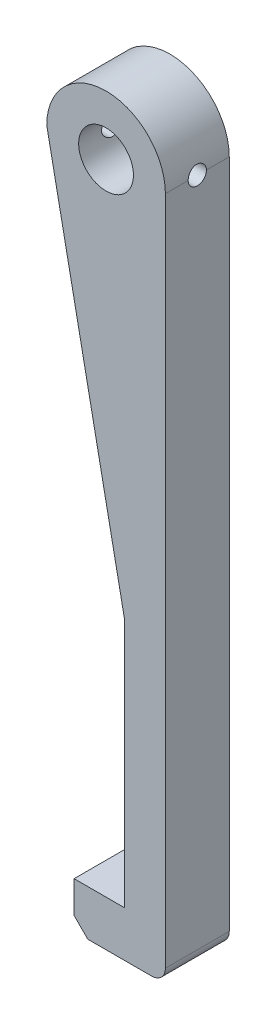
ISO-10303-21;
HEADER;
FILE_DESCRIPTION(('STEP AP214'),'2;1');
FILE_NAME('part.step','',(''),(''),'','','');
FILE_SCHEMA(('AUTOMOTIVE_DESIGN { 1 0 10303 214 1 1 1 1 }'));
ENDSEC;
DATA;
#1=APPLICATION_CONTEXT('core data for automotive mechanical design processes');
#2=APPLICATION_PROTOCOL_DEFINITION('international standard','automotive_design',2000,#1);
#3=PRODUCT_CONTEXT('',#1,'mechanical');
#4=PRODUCT('Part','Part','',(#3));
#5=PRODUCT_RELATED_PRODUCT_CATEGORY('part','',(#4));
#6=PRODUCT_DEFINITION_FORMATION('','',#4);
#7=PRODUCT_DEFINITION_CONTEXT('part definition',#1,'design');
#8=PRODUCT_DEFINITION('design','',#6,#7);
#9=PRODUCT_DEFINITION_SHAPE('','',#8);
#10=(LENGTH_UNIT() NAMED_UNIT(*) SI_UNIT(.MILLI.,.METRE.));
#11=(NAMED_UNIT(*) PLANE_ANGLE_UNIT() SI_UNIT($,.RADIAN.));
#12=(NAMED_UNIT(*) SI_UNIT($,.STERADIAN.) SOLID_ANGLE_UNIT());
#13=UNCERTAINTY_MEASURE_WITH_UNIT(LENGTH_MEASURE(1.E-05),#10,'distance_accuracy_value','');
#14=(GEOMETRIC_REPRESENTATION_CONTEXT(3) GLOBAL_UNCERTAINTY_ASSIGNED_CONTEXT((#13)) GLOBAL_UNIT_ASSIGNED_CONTEXT((#10,
#11,#12)) REPRESENTATION_CONTEXT('',''));
#15=CARTESIAN_POINT('',(0.,0.,0.));
#16=DIRECTION('',(0.,0.,1.));
#17=DIRECTION('',(1.,0.,0.));
#18=AXIS2_PLACEMENT_3D('',#15,#16,#17);
#19=CARTESIAN_POINT('',(-3.99999999999999,75.,14.));
#20=DIRECTION('',(0.,0.,-1.));
#21=DIRECTION('',(-1.,0.,0.));
#22=AXIS2_PLACEMENT_3D('',#19,#20,#21);
#23=PLANE('',#22);
#24=DIRECTION('',(1.,0.,0.));
#25=VECTOR('',#24,1.);
#26=CARTESIAN_POINT('',(-7.99999999999999,-75.,14.));
#27=LINE('',#26,#25);
#28=CARTESIAN_POINT('',(-7.99999999999999,-75.,14.));
#29=VERTEX_POINT('',#28);
#30=CARTESIAN_POINT('',(6.00000000000001,-75.,14.));
#31=VERTEX_POINT('',#30);
#32=EDGE_CURVE('E236',#29,#31,#27,.T.);
#33=ORIENTED_EDGE('',*,*,#32,.T.);
#34=CARTESIAN_POINT('',(6.00000000000001,-72.,14.));
#35=DIRECTION('',(0.,0.,-1.));
#36=DIRECTION('',(-1.,0.,0.));
#37=AXIS2_PLACEMENT_3D('',#34,#35,#36);
#38=CIRCLE('',#37,3.);
#39=CARTESIAN_POINT('',(9.00000000000001,-72.,14.));
#40=VERTEX_POINT('',#39);
#41=EDGE_CURVE('E11',#31,#40,#38,.F.);
#42=ORIENTED_EDGE('',*,*,#41,.T.);
#43=DIRECTION('',(0.,1.,0.));
#44=VECTOR('',#43,1.);
#45=CARTESIAN_POINT('',(9.00000000000001,-75.,14.));
#46=LINE('',#45,#44);
#47=CARTESIAN_POINT('',(9.00000000000001,75.,14.));
#48=VERTEX_POINT('',#47);
#49=EDGE_CURVE('E260',#40,#48,#46,.T.);
#50=ORIENTED_EDGE('',*,*,#49,.T.);
#51=CARTESIAN_POINT('',(-3.99999999999999,75.,14.));
#52=DIRECTION('',(0.,0.,1.));
#53=DIRECTION('',(-1.,0.,0.));
#54=AXIS2_PLACEMENT_3D('',#51,#52,#53);
#55=CIRCLE('',#54,13.);
#56=CARTESIAN_POINT('',(-17.,75.,14.));
#57=VERTEX_POINT('',#56);
#58=EDGE_CURVE('E262',#48,#57,#55,.T.);
#59=ORIENTED_EDGE('',*,*,#58,.T.);
#60=DIRECTION('',(0.196116135138184,-0.98058067569092,0.));
#61=VECTOR('',#60,1.);
#62=CARTESIAN_POINT('',(0.,-10.,14.));
#63=LINE('',#62,#61);
#64=CARTESIAN_POINT('',(0.,-10.,14.));
#65=VERTEX_POINT('',#64);
#66=EDGE_CURVE('E141',#57,#65,#63,.T.);
#67=ORIENTED_EDGE('',*,*,#66,.T.);
#68=DIRECTION('',(0.,-1.,0.));
#69=VECTOR('',#68,1.);
#70=CARTESIAN_POINT('',(0.,-65.,14.));
#71=LINE('',#70,#69);
#72=CARTESIAN_POINT('',(0.,-65.,14.));
#73=VERTEX_POINT('',#72);
#74=EDGE_CURVE('E249',#65,#73,#71,.T.);
#75=ORIENTED_EDGE('',*,*,#74,.T.);
#76=DIRECTION('',(-1.,0.,0.));
#77=VECTOR('',#76,1.);
#78=CARTESIAN_POINT('',(0.,-65.,14.));
#79=LINE('',#78,#77);
#80=CARTESIAN_POINT('',(-11.,-65.,14.));
#81=VERTEX_POINT('',#80);
#82=EDGE_CURVE('E252',#73,#81,#79,.T.);
#83=ORIENTED_EDGE('',*,*,#82,.T.);
#84=DIRECTION('',(0.,-1.,0.));
#85=VECTOR('',#84,1.);
#86=CARTESIAN_POINT('',(-11.,-65.,14.));
#87=LINE('',#86,#85);
#88=CARTESIAN_POINT('',(-11.,-72.,14.));
#89=VERTEX_POINT('',#88);
#90=EDGE_CURVE('E255',#81,#89,#87,.T.);
#91=ORIENTED_EDGE('',*,*,#90,.T.);
#92=DIRECTION('',(0.707106781186547,-0.707106781186548,0.));
#93=VECTOR('',#92,1.);
#94=CARTESIAN_POINT('',(-11.,-72.,14.));
#95=LINE('',#94,#93);
#96=EDGE_CURVE('E257',#89,#29,#95,.T.);
#97=ORIENTED_EDGE('',*,*,#96,.T.);
#98=EDGE_LOOP('',(#33,#42,#50,#59,#67,#75,#83,#91,#97));
#99=FACE_BOUND('',#98,.T.);
#100=CARTESIAN_POINT('',(-3.99999999999999,75.,14.));
#101=DIRECTION('',(0.,0.,1.));
#102=DIRECTION('',(1.,0.,0.));
#103=AXIS2_PLACEMENT_3D('',#100,#101,#102);
#104=CIRCLE('',#103,6.00000000000001);
#105=CARTESIAN_POINT('',(2.00000000000002,75.,14.));
#106=VERTEX_POINT('',#105);
#107=EDGE_CURVE('E240',#106,#106,#104,.T.);
#108=ORIENTED_EDGE('',*,*,#107,.F.);
#109=EDGE_LOOP('',(#108));
#110=FACE_BOUND('',#109,.T.);
#111=ADVANCED_FACE('F37',(#99,#110),#23,.F.);
#112=CARTESIAN_POINT('',(-3.99999999999999,75.,0.));
#113=DIRECTION('',(0.,0.,-1.));
#114=DIRECTION('',(-1.,0.,0.));
#115=AXIS2_PLACEMENT_3D('',#112,#113,#114);
#116=PLANE('',#115);
#117=DIRECTION('',(0.,1.,0.));
#118=VECTOR('',#117,1.);
#119=CARTESIAN_POINT('',(9.00000000000001,-75.,0.));
#120=LINE('',#119,#118);
#121=CARTESIAN_POINT('',(9.00000000000001,-72.,0.));
#122=VERTEX_POINT('',#121);
#123=CARTESIAN_POINT('',(9.00000000000001,75.,0.));
#124=VERTEX_POINT('',#123);
#125=EDGE_CURVE('E272',#122,#124,#120,.T.);
#126=ORIENTED_EDGE('',*,*,#125,.F.);
#127=CARTESIAN_POINT('',(6.00000000000001,-72.,0.));
#128=DIRECTION('',(0.,0.,-1.));
#129=DIRECTION('',(-1.,0.,0.));
#130=AXIS2_PLACEMENT_3D('',#127,#128,#129);
#131=CIRCLE('',#130,3.);
#132=CARTESIAN_POINT('',(6.00000000000001,-75.,0.));
#133=VERTEX_POINT('',#132);
#134=EDGE_CURVE('E59',#122,#133,#131,.T.);
#135=ORIENTED_EDGE('',*,*,#134,.T.);
#136=DIRECTION('',(1.,0.,0.));
#137=VECTOR('',#136,1.);
#138=CARTESIAN_POINT('',(-7.99999999999999,-75.,0.));
#139=LINE('',#138,#137);
#140=CARTESIAN_POINT('',(-7.99999999999999,-75.,0.));
#141=VERTEX_POINT('',#140);
#142=EDGE_CURVE('E270',#141,#133,#139,.T.);
#143=ORIENTED_EDGE('',*,*,#142,.F.);
#144=DIRECTION('',(0.707106781186547,-0.707106781186548,0.));
#145=VECTOR('',#144,1.);
#146=CARTESIAN_POINT('',(-11.,-72.,0.));
#147=LINE('',#146,#145);
#148=CARTESIAN_POINT('',(-11.,-72.,0.));
#149=VERTEX_POINT('',#148);
#150=EDGE_CURVE('E268',#149,#141,#147,.T.);
#151=ORIENTED_EDGE('',*,*,#150,.F.);
#152=DIRECTION('',(0.,-1.,0.));
#153=VECTOR('',#152,1.);
#154=CARTESIAN_POINT('',(-11.,-65.,0.));
#155=LINE('',#154,#153);
#156=CARTESIAN_POINT('',(-11.,-65.,0.));
#157=VERTEX_POINT('',#156);
#158=EDGE_CURVE('E266',#157,#149,#155,.T.);
#159=ORIENTED_EDGE('',*,*,#158,.F.);
#160=DIRECTION('',(-1.,0.,0.));
#161=VECTOR('',#160,1.);
#162=CARTESIAN_POINT('',(0.,-65.,0.));
#163=LINE('',#162,#161);
#164=CARTESIAN_POINT('',(0.,-65.,0.));
#165=VERTEX_POINT('',#164);
#166=EDGE_CURVE('E244',#165,#157,#163,.T.);
#167=ORIENTED_EDGE('',*,*,#166,.F.);
#168=DIRECTION('',(0.,-1.,0.));
#169=VECTOR('',#168,1.);
#170=CARTESIAN_POINT('',(0.,-65.,0.));
#171=LINE('',#170,#169);
#172=CARTESIAN_POINT('',(0.,-10.,0.));
#173=VERTEX_POINT('',#172);
#174=EDGE_CURVE('E242',#173,#165,#171,.T.);
#175=ORIENTED_EDGE('',*,*,#174,.F.);
#176=DIRECTION('',(0.196116135138184,-0.98058067569092,0.));
#177=VECTOR('',#176,1.);
#178=CARTESIAN_POINT('',(0.,-10.,0.));
#179=LINE('',#178,#177);
#180=CARTESIAN_POINT('',(-17.,75.,0.));
#181=VERTEX_POINT('',#180);
#182=EDGE_CURVE('E253',#181,#173,#179,.T.);
#183=ORIENTED_EDGE('',*,*,#182,.F.);
#184=CARTESIAN_POINT('',(-3.99999999999999,75.,0.));
#185=DIRECTION('',(0.,0.,1.));
#186=DIRECTION('',(-1.,0.,0.));
#187=AXIS2_PLACEMENT_3D('',#184,#185,#186);
#188=CIRCLE('',#187,13.);
#189=EDGE_CURVE('E274',#124,#181,#188,.T.);
#190=ORIENTED_EDGE('',*,*,#189,.F.);
#191=EDGE_LOOP('',(#126,#135,#143,#151,#159,#167,#175,#183,#190));
#192=FACE_BOUND('',#191,.T.);
#193=CARTESIAN_POINT('',(-3.99999999999999,75.,0.));
#194=DIRECTION('',(0.,0.,1.));
#195=DIRECTION('',(1.,0.,0.));
#196=AXIS2_PLACEMENT_3D('',#193,#194,#195);
#197=CIRCLE('',#196,6.00000000000001);
#198=CARTESIAN_POINT('',(2.00000000000002,75.,0.));
#199=VERTEX_POINT('',#198);
#200=EDGE_CURVE('E243',#199,#199,#197,.T.);
#201=ORIENTED_EDGE('',*,*,#200,.T.);
#202=EDGE_LOOP('',(#201));
#203=FACE_BOUND('',#202,.T.);
#204=ADVANCED_FACE('F225',(#192,#203),#116,.T.);
#205=CARTESIAN_POINT('',(0.,-65.,14.));
#206=DIRECTION('',(1.,0.,0.));
#207=DIRECTION('',(0.,1.,0.));
#208=AXIS2_PLACEMENT_3D('',#205,#206,#207);
#209=PLANE('',#208);
#210=ORIENTED_EDGE('',*,*,#174,.T.);
#211=DIRECTION('',(0.,0.,-1.));
#212=VECTOR('',#211,1.);
#213=CARTESIAN_POINT('',(0.,-65.,14.));
#214=LINE('',#213,#212);
#215=EDGE_CURVE('E160',#73,#165,#214,.T.);
#216=ORIENTED_EDGE('',*,*,#215,.F.);
#217=ORIENTED_EDGE('',*,*,#74,.F.);
#218=DIRECTION('',(0.,0.,-1.));
#219=VECTOR('',#218,1.);
#220=CARTESIAN_POINT('',(0.,-10.,14.));
#221=LINE('',#220,#219);
#222=EDGE_CURVE('E147',#65,#173,#221,.T.);
#223=ORIENTED_EDGE('',*,*,#222,.T.);
#224=EDGE_LOOP('',(#210,#216,#217,#223));
#225=FACE_BOUND('',#224,.T.);
#226=ADVANCED_FACE('F222',(#225),#209,.F.);
#227=CARTESIAN_POINT('',(0.,-65.,14.));
#228=DIRECTION('',(0.,-1.,0.));
#229=DIRECTION('',(0.,0.,-1.));
#230=AXIS2_PLACEMENT_3D('',#227,#228,#229);
#231=PLANE('',#230);
#232=ORIENTED_EDGE('',*,*,#166,.T.);
#233=DIRECTION('',(0.,0.,-1.));
#234=VECTOR('',#233,1.);
#235=CARTESIAN_POINT('',(-11.,-65.,14.));
#236=LINE('',#235,#234);
#237=EDGE_CURVE('E157',#81,#157,#236,.T.);
#238=ORIENTED_EDGE('',*,*,#237,.F.);
#239=ORIENTED_EDGE('',*,*,#82,.F.);
#240=ORIENTED_EDGE('',*,*,#215,.T.);
#241=EDGE_LOOP('',(#232,#238,#239,#240));
#242=FACE_BOUND('',#241,.T.);
#243=ADVANCED_FACE('F219',(#242),#231,.F.);
#244=CARTESIAN_POINT('',(-11.,-65.,14.));
#245=DIRECTION('',(1.,0.,0.));
#246=DIRECTION('',(0.,0.,-1.));
#247=AXIS2_PLACEMENT_3D('',#244,#245,#246);
#248=PLANE('',#247);
#249=ORIENTED_EDGE('',*,*,#158,.T.);
#250=DIRECTION('',(0.,0.,-1.));
#251=VECTOR('',#250,1.);
#252=CARTESIAN_POINT('',(-11.,-72.,14.));
#253=LINE('',#252,#251);
#254=EDGE_CURVE('E154',#89,#149,#253,.T.);
#255=ORIENTED_EDGE('',*,*,#254,.F.);
#256=ORIENTED_EDGE('',*,*,#90,.F.);
#257=ORIENTED_EDGE('',*,*,#237,.T.);
#258=EDGE_LOOP('',(#249,#255,#256,#257));
#259=FACE_BOUND('',#258,.T.);
#260=ADVANCED_FACE('F215',(#259),#248,.F.);
#261=CARTESIAN_POINT('',(-11.,-72.,14.));
#262=DIRECTION('',(0.707106781186548,0.707106781186547,0.));
#263=DIRECTION('',(-0.707106781186547,0.707106781186548,0.));
#264=AXIS2_PLACEMENT_3D('',#261,#262,#263);
#265=PLANE('',#264);
#266=ORIENTED_EDGE('',*,*,#150,.T.);
#267=DIRECTION('',(0.,0.,-1.));
#268=VECTOR('',#267,1.);
#269=CARTESIAN_POINT('',(-7.99999999999999,-75.,14.));
#270=LINE('',#269,#268);
#271=EDGE_CURVE('E151',#29,#141,#270,.T.);
#272=ORIENTED_EDGE('',*,*,#271,.F.);
#273=ORIENTED_EDGE('',*,*,#96,.F.);
#274=ORIENTED_EDGE('',*,*,#254,.T.);
#275=EDGE_LOOP('',(#266,#272,#273,#274));
#276=FACE_BOUND('',#275,.T.);
#277=ADVANCED_FACE('F212',(#276),#265,.F.);
#278=CARTESIAN_POINT('',(-7.99999999999999,-75.,14.));
#279=DIRECTION('',(0.,1.,0.));
#280=DIRECTION('',(0.,0.,1.));
#281=AXIS2_PLACEMENT_3D('',#278,#279,#280);
#282=PLANE('',#281);
#283=ORIENTED_EDGE('',*,*,#142,.T.);
#284=DIRECTION('',(0.,0.,-1.));
#285=VECTOR('',#284,1.);
#286=CARTESIAN_POINT('',(6.00000000000001,-75.,14.));
#287=LINE('',#286,#285);
#288=EDGE_CURVE('E45',#133,#31,#287,.F.);
#289=ORIENTED_EDGE('',*,*,#288,.T.);
#290=ORIENTED_EDGE('',*,*,#32,.F.);
#291=ORIENTED_EDGE('',*,*,#271,.T.);
#292=EDGE_LOOP('',(#283,#289,#290,#291));
#293=FACE_BOUND('',#292,.T.);
#294=ADVANCED_FACE('F208',(#293),#282,.F.);
#295=CARTESIAN_POINT('',(9.00000000000001,-75.,14.));
#296=DIRECTION('',(-1.,0.,0.));
#297=DIRECTION('',(0.,0.,1.));
#298=AXIS2_PLACEMENT_3D('',#295,#296,#297);
#299=PLANE('',#298);
#300=ORIENTED_EDGE('',*,*,#49,.F.);
#301=DIRECTION('',(0.,0.,-1.));
#302=VECTOR('',#301,1.);
#303=CARTESIAN_POINT('',(9.00000000000001,-72.,14.));
#304=LINE('',#303,#302);
#305=EDGE_CURVE('E163',#40,#122,#304,.T.);
#306=ORIENTED_EDGE('',*,*,#305,.T.);
#307=ORIENTED_EDGE('',*,*,#125,.T.);
#308=DIRECTION('',(0.,0.,-1.));
#309=VECTOR('',#308,1.);
#310=CARTESIAN_POINT('',(9.00000000000001,75.,14.));
#311=LINE('',#310,#309);
#312=CARTESIAN_POINT('',(9.00000000000001,75.,5.));
#313=VERTEX_POINT('',#312);
#314=EDGE_CURVE('E142',#313,#124,#311,.T.);
#315=ORIENTED_EDGE('',*,*,#314,.F.);
#316=CARTESIAN_POINT('',(9.00000000000001,75.,7.));
#317=DIRECTION('',(1.,0.,0.));
#318=DIRECTION('',(0.,0.,-1.));
#319=AXIS2_PLACEMENT_3D('',#316,#317,#318);
#320=CIRCLE('',#319,2.);
#321=CARTESIAN_POINT('',(9.00000000000001,75.,9.));
#322=VERTEX_POINT('',#321);
#323=EDGE_CURVE('E172',#322,#313,#320,.T.);
#324=ORIENTED_EDGE('',*,*,#323,.F.);
#325=EDGE_CURVE('E145',#48,#322,#311,.T.);
#326=ORIENTED_EDGE('',*,*,#325,.F.);
#327=EDGE_LOOP('',(#300,#306,#307,#315,#324,#326));
#328=FACE_BOUND('',#327,.T.);
#329=ADVANCED_FACE('F203',(#328),#299,.F.);
#330=CARTESIAN_POINT('',(-3.99999999999999,75.,14.));
#331=DIRECTION('',(0.,0.,-1.));
#332=DIRECTION('',(-1.,0.,0.));
#333=AXIS2_PLACEMENT_3D('',#330,#331,#332);
#334=CYLINDRICAL_SURFACE('',#333,13.);
#335=ORIENTED_EDGE('',*,*,#325,.T.);
#336=CARTESIAN_POINT('',(9.00000000000001,75.,9.));
#337=CARTESIAN_POINT('',(9.00000200624245,75.0559173083005,9.00000001239874));
#338=CARTESIAN_POINT('',(8.99963876887101,75.1118075129407,8.99765345986566));
#339=CARTESIAN_POINT('',(8.99820310813059,75.223181650767,8.98829464061037));
#340=CARTESIAN_POINT('',(8.99713074888542,75.2786656202291,8.98128279575661));
#341=CARTESIAN_POINT('',(8.99288768795326,75.4437675589348,8.9533283726329));
#342=CARTESIAN_POINT('',(8.98869082967937,75.5522695590988,8.92546664135297));
#343=CARTESIAN_POINT('',(8.9780206664357,75.762984825654,8.85211273096216));
#344=CARTESIAN_POINT('',(8.9715467598383,75.8651964216393,8.80661589208778));
#345=CARTESIAN_POINT('',(8.95703796949745,76.0605486271046,8.69930852348968));
#346=CARTESIAN_POINT('',(8.9490031213996,76.1536894436517,8.63749836628475));
#347=CARTESIAN_POINT('',(8.93219283293925,76.3289898773499,8.49878989750917));
#348=CARTESIAN_POINT('',(8.92341245834179,76.4110652364726,8.42178573508671));
#349=CARTESIAN_POINT('',(8.90613809032032,76.5611929048478,8.25509333231553));
#350=CARTESIAN_POINT('',(8.89764414198702,76.6292430147134,8.16540310629901));
#351=CARTESIAN_POINT('',(8.88185694054029,76.7497101043496,7.97531549862524));
#352=CARTESIAN_POINT('',(8.87457013171583,76.8020443194494,7.87486508497874));
#353=CARTESIAN_POINT('',(8.86209105054054,76.8890627247252,7.66647484799151));
#354=CARTESIAN_POINT('',(8.85689853675243,76.9237489495407,7.55853588963749));
#355=CARTESIAN_POINT('',(8.84924460376366,76.9742254954324,7.33912552477942));
#356=CARTESIAN_POINT('',(8.84676205917367,76.9901620553452,7.22768851183686));
#357=CARTESIAN_POINT('',(8.8447450549237,77.0031401167573,7.00369377438666));
#358=CARTESIAN_POINT('',(8.84521048790529,77.0001823063452,6.89113609084026));
#359=CARTESIAN_POINT('',(8.84901764435481,76.9755743251789,6.66913655889084));
#360=CARTESIAN_POINT('',(8.85233417589048,76.9540878659661,6.55967606909733));
#361=CARTESIAN_POINT('',(8.8614304435468,76.8932890474257,6.3459332847649));
#362=CARTESIAN_POINT('',(8.86721023773971,76.8539762678351,6.24165111237127));
#363=CARTESIAN_POINT('',(8.88060961035569,76.7584706885592,6.04072634293581));
#364=CARTESIAN_POINT('',(8.88823672130586,76.7022085418932,5.94411723172592));
#365=CARTESIAN_POINT('',(8.90446555589918,76.5744527548831,5.76165288740311));
#366=CARTESIAN_POINT('',(8.91306730885393,76.5029586563929,5.67579797787801));
#367=CARTESIAN_POINT('',(8.93038651121885,76.3458823434593,5.51633694291781));
#368=CARTESIAN_POINT('',(8.93910423303172,76.2601612508695,5.44286759621104));
#369=CARTESIAN_POINT('',(8.95559266881333,76.0775026154478,5.31131545778279));
#370=CARTESIAN_POINT('',(8.96336311083526,75.9805618671538,5.25323707893776));
#371=CARTESIAN_POINT('',(8.97709124951905,75.7780818125592,5.15410757337316));
#372=CARTESIAN_POINT('',(8.98304672478885,75.6725321681694,5.11307729019673));
#373=CARTESIAN_POINT('',(8.99244962385738,75.4560021049891,5.04942215694251));
#374=CARTESIAN_POINT('',(8.99590079425467,75.345030065049,5.02676980629542));
#375=CARTESIAN_POINT('',(8.99860544316276,75.1943578417745,5.00908241398876));
#376=CARTESIAN_POINT('',(8.99912799956423,75.1555317571228,5.00567500883258));
#377=CARTESIAN_POINT('',(8.99982490122987,75.0778093814998,5.00113679973477));
#378=CARTESIAN_POINT('',(8.99999983296923,75.0389133197724,5.00000216139794));
#379=CARTESIAN_POINT('',(9.00000000000001,75.,5.));
#380=B_SPLINE_CURVE_WITH_KNOTS('',3,(#336,#337,#338,#339,#340,#341,#342,#343,#344,#345,#346,
#347,#348,#349,#350,#351,#352,#353,#354,#355,#356,#357,#358,#359,#360,#361,#362,#363,#364,#365,
#366,#367,#368,#369,#370,#371,#372,#373,#374,#375,#376,#377,#378,#379),.UNSPECIFIED.,.F.,.F.,(4,
2,2,2,2,2,2,2,2,2,2,2,2,2,2,2,2,2,2,2,2,4),(0.,0.167647874144424,0.335280590451942,
0.669853037401047,1.00451394949927,1.33916722019099,1.67623990416831,2.01336540646609,
2.35223637510513,2.69106826640134,3.02723952521046,3.36339854152085,3.69661747686578,
4.02984426839434,4.36445338669547,4.69907257077792,5.03717430503675,5.37537287471738,
5.71398372855854,6.05208694879281,6.16897288073366,6.28566144723498),.UNSPECIFIED.);
#381=EDGE_CURVE('E137',#322,#313,#380,.T.);
#382=ORIENTED_EDGE('',*,*,#381,.T.);
#383=ORIENTED_EDGE('',*,*,#314,.T.);
#384=ORIENTED_EDGE('',*,*,#189,.T.);
#385=DIRECTION('',(0.,0.,-1.));
#386=VECTOR('',#385,1.);
#387=CARTESIAN_POINT('',(-17.,75.,14.));
#388=LINE('',#387,#386);
#389=CARTESIAN_POINT('',(-17.,75.,5.));
#390=VERTEX_POINT('',#389);
#391=EDGE_CURVE('E136',#390,#181,#388,.T.);
#392=ORIENTED_EDGE('',*,*,#391,.F.);
#393=CARTESIAN_POINT('',(-17.,75.,5.));
#394=CARTESIAN_POINT('',(-17.0000020062424,75.0559173083005,4.99999998760126));
#395=CARTESIAN_POINT('',(-16.999638768871,75.1118075129407,5.00234654013434));
#396=CARTESIAN_POINT('',(-16.9982031081306,75.223181650767,5.01170535938963));
#397=CARTESIAN_POINT('',(-16.9971307488854,75.2786656202291,5.01871720424339));
#398=CARTESIAN_POINT('',(-16.9928876879532,75.4437675589348,5.0466716273671));
#399=CARTESIAN_POINT('',(-16.9886908296793,75.5522695590988,5.07453335864703));
#400=CARTESIAN_POINT('',(-16.9780206664357,75.762984825654,5.14788726903784));
#401=CARTESIAN_POINT('',(-16.9715467598383,75.8651964216393,5.19338410791222));
#402=CARTESIAN_POINT('',(-16.9570379694974,76.0605486271046,5.30069147651032));
#403=CARTESIAN_POINT('',(-16.9490031213996,76.1536894436517,5.36250163371525));
#404=CARTESIAN_POINT('',(-16.9321928329392,76.3289898773499,5.50121010249083));
#405=CARTESIAN_POINT('',(-16.9234124583418,76.4110652364726,5.57821426491328));
#406=CARTESIAN_POINT('',(-16.9061380903203,76.5611929048478,5.74490666768447));
#407=CARTESIAN_POINT('',(-16.897644141987,76.6292430147134,5.83459689370099));
#408=CARTESIAN_POINT('',(-16.8818569405403,76.7497101043496,6.02468450137476));
#409=CARTESIAN_POINT('',(-16.8745701317158,76.8020443194494,6.12513491502126));
#410=CARTESIAN_POINT('',(-16.8620910505405,76.8890627247252,6.33352515200849));
#411=CARTESIAN_POINT('',(-16.8568985367524,76.9237489495407,6.44146411036251));
#412=CARTESIAN_POINT('',(-16.8492446037636,76.9742254954324,6.66087447522058));
#413=CARTESIAN_POINT('',(-16.8467620591736,76.9901620553452,6.77231148816314));
#414=CARTESIAN_POINT('',(-16.8447450549237,77.0031401167573,6.99630622561334));
#415=CARTESIAN_POINT('',(-16.8452104879053,77.0001823063452,7.10886390915974));
#416=CARTESIAN_POINT('',(-16.8490176443548,76.9755743251789,7.33086344110916));
#417=CARTESIAN_POINT('',(-16.8523341758905,76.9540878659661,7.44032393090267));
#418=CARTESIAN_POINT('',(-16.8614304435468,76.8932890474257,7.6540667152351));
#419=CARTESIAN_POINT('',(-16.8672102377397,76.8539762678351,7.75834888762873));
#420=CARTESIAN_POINT('',(-16.8806096103557,76.7584706885592,7.95927365706419));
#421=CARTESIAN_POINT('',(-16.8882367213058,76.7022085418932,8.05588276827407));
#422=CARTESIAN_POINT('',(-16.9044655558992,76.5744527548831,8.23834711259689));
#423=CARTESIAN_POINT('',(-16.9130673088539,76.5029586563929,8.32420202212199));
#424=CARTESIAN_POINT('',(-16.9303865112188,76.3458823434593,8.48366305708219));
#425=CARTESIAN_POINT('',(-16.9391042330317,76.2601612508695,8.55713240378896));
#426=CARTESIAN_POINT('',(-16.9555926688133,76.0775026154478,8.68868454221721));
#427=CARTESIAN_POINT('',(-16.9633631108352,75.9805618671538,8.74676292106224));
#428=CARTESIAN_POINT('',(-16.977091249519,75.7780818125592,8.84589242662684));
#429=CARTESIAN_POINT('',(-16.9830467247888,75.6725321681695,8.88692270980327));
#430=CARTESIAN_POINT('',(-16.9924496238574,75.4560021049892,8.95057784305749));
#431=CARTESIAN_POINT('',(-16.9959007942546,75.345030065049,8.97323019370458));
#432=CARTESIAN_POINT('',(-16.9986054431627,75.1943578417745,8.99091758601124));
#433=CARTESIAN_POINT('',(-16.9991279995642,75.1555317571228,8.99432499116742));
#434=CARTESIAN_POINT('',(-16.9998249012299,75.0778093814998,8.99886320026523));
#435=CARTESIAN_POINT('',(-16.9999998329692,75.0389133197724,8.99999783860206));
#436=CARTESIAN_POINT('',(-17.,75.,9.));
#437=B_SPLINE_CURVE_WITH_KNOTS('',3,(#393,#394,#395,#396,#397,#398,#399,#400,#401,#402,#403,
#404,#405,#406,#407,#408,#409,#410,#411,#412,#413,#414,#415,#416,#417,#418,#419,#420,#421,#422,
#423,#424,#425,#426,#427,#428,#429,#430,#431,#432,#433,#434,#435,#436),.UNSPECIFIED.,.F.,.F.,(4,
2,2,2,2,2,2,2,2,2,2,2,2,2,2,2,2,2,2,2,2,4),(0.,0.167647874144424,0.335280590451941,
0.669853037401047,1.00451394949927,1.33916722019099,1.67623990416831,2.01336540646609,
2.35223637510513,2.69106826640134,3.02723952521046,3.36339854152085,3.69661747686578,
4.02984426839434,4.36445338669547,4.69907257077792,5.03717430503675,5.37537287471738,
5.71398372855853,6.05208694879281,6.16897288073366,6.28566144723498),.UNSPECIFIED.);
#438=CARTESIAN_POINT('',(-17.,75.,9.));
#439=VERTEX_POINT('',#438);
#440=EDGE_CURVE('E122',#390,#439,#437,.T.);
#441=ORIENTED_EDGE('',*,*,#440,.T.);
#442=EDGE_CURVE('E133',#57,#439,#388,.T.);
#443=ORIENTED_EDGE('',*,*,#442,.F.);
#444=ORIENTED_EDGE('',*,*,#58,.F.);
#445=EDGE_LOOP('',(#335,#382,#383,#384,#392,#441,#443,#444));
#446=FACE_BOUND('',#445,.T.);
#447=ADVANCED_FACE('F131',(#446),#334,.T.);
#448=CARTESIAN_POINT('',(0.,-10.,14.));
#449=DIRECTION('',(0.98058067569092,0.196116135138184,0.));
#450=DIRECTION('',(-0.196116135138184,0.98058067569092,0.));
#451=AXIS2_PLACEMENT_3D('',#448,#449,#450);
#452=PLANE('',#451);
#453=ORIENTED_EDGE('',*,*,#442,.T.);
#454=CARTESIAN_POINT('',(-17.,75.,7.));
#455=DIRECTION('',(0.98058067569092,0.196116135138184,0.));
#456=DIRECTION('',(0.196116135138184,-0.98058067569092,0.));
#457=AXIS2_PLACEMENT_3D('',#454,#455,#456);
#458=ELLIPSE('',#457,2.03960780543711,2.);
#459=EDGE_CURVE('E119',#439,#390,#458,.T.);
#460=ORIENTED_EDGE('',*,*,#459,.T.);
#461=ORIENTED_EDGE('',*,*,#391,.T.);
#462=ORIENTED_EDGE('',*,*,#182,.T.);
#463=ORIENTED_EDGE('',*,*,#222,.F.);
#464=ORIENTED_EDGE('',*,*,#66,.F.);
#465=EDGE_LOOP('',(#453,#460,#461,#462,#463,#464));
#466=FACE_BOUND('',#465,.T.);
#467=ADVANCED_FACE('F139',(#466),#452,.F.);
#468=CARTESIAN_POINT('',(-3.99999999999999,75.,14.));
#469=DIRECTION('',(0.,0.,-1.));
#470=DIRECTION('',(-1.,0.,0.));
#471=AXIS2_PLACEMENT_3D('',#468,#469,#470);
#472=CYLINDRICAL_SURFACE('',#471,6.00000000000001);
#473=CARTESIAN_POINT('',(-9.99999999999999,75.,9.));
#474=CARTESIAN_POINT('',(-10.0000003060189,74.8908732742266,9.00000050746328));
#475=CARTESIAN_POINT('',(-9.99699539015089,74.7817496109229,8.99103946774557));
#476=CARTESIAN_POINT('',(-9.98530420406561,74.5667164782541,8.95554178236556));
#477=CARTESIAN_POINT('',(-9.97661734404304,74.4608073437624,8.92900331210216));
#478=CARTESIAN_POINT('',(-9.95450615812885,74.2553344209964,8.8593615132319));
#479=CARTESIAN_POINT('',(-9.94108975461706,74.1557603482279,8.81628587508146));
#480=CARTESIAN_POINT('',(-9.91088891434683,73.9652501263894,8.71491765432331));
#481=CARTESIAN_POINT('',(-9.89410381335555,73.8743156860826,8.6566220699948));
#482=CARTESIAN_POINT('',(-9.85828188886009,73.7005166499555,8.52434839028249));
#483=CARTESIAN_POINT('',(-9.83919112927569,73.6179925994034,8.44993753147901));
#484=CARTESIAN_POINT('',(-9.80120629566242,73.4663346145958,8.28846569058686));
#485=CARTESIAN_POINT('',(-9.78231226581097,73.3972036290211,8.20140193014296));
#486=CARTESIAN_POINT('',(-9.74626664954547,73.2723501155443,8.01402976960707));
#487=CARTESIAN_POINT('',(-9.72918078551376,73.2170702835579,7.91341252053575));
#488=CARTESIAN_POINT('',(-9.69950610837202,73.1243622522446,7.7036478110829));
#489=CARTESIAN_POINT('',(-9.6869159232149,73.0869286052265,7.59450296567451));
#490=CARTESIAN_POINT('',(-9.66822606538754,73.0322530769817,7.37465355700657));
#491=CARTESIAN_POINT('',(-9.66192191539222,73.0143731034565,7.26412558302187));
#492=CARTESIAN_POINT('',(-9.65591313259015,72.9973177533311,7.04147249168823));
#493=CARTESIAN_POINT('',(-9.65620646045459,72.9981365967906,6.92934787858162));
#494=CARTESIAN_POINT('',(-9.6631803001636,73.0179601925932,6.71212673911195));
#495=CARTESIAN_POINT('',(-9.66956831735065,73.036132173666,6.60694319416196));
#496=CARTESIAN_POINT('',(-9.68753315449101,73.0887876743012,6.40121316078632));
#497=CARTESIAN_POINT('',(-9.69911059568215,73.1232731468163,6.30066722912986));
#498=CARTESIAN_POINT('',(-9.72635822262497,73.2081218838796,6.10517450081704));
#499=CARTESIAN_POINT('',(-9.74209131586234,73.2587319025855,6.01034394906094));
#500=CARTESIAN_POINT('',(-9.77585117151452,73.3742217873937,5.83025818344054));
#501=CARTESIAN_POINT('',(-9.79387859580927,73.439105775272,5.74500574613323));
#502=CARTESIAN_POINT('',(-9.83134658335481,73.5853013346355,5.58181680367845));
#503=CARTESIAN_POINT('',(-9.85081178709685,73.6672936998474,5.50449461098186));
#504=CARTESIAN_POINT('',(-9.88813876774073,73.8433208600599,5.3645374666732));
#505=CARTESIAN_POINT('',(-9.90600039076134,73.9373568086784,5.30190392367101));
#506=CARTESIAN_POINT('',(-9.93834215875587,74.1361047739075,5.19260739952986));
#507=CARTESIAN_POINT('',(-9.95278700016078,74.2409134471673,5.14610901731853));
#508=CARTESIAN_POINT('',(-9.97641134288869,74.457461833271,5.07159365208858));
#509=CARTESIAN_POINT('',(-9.98559267309758,74.5691991236901,5.04357024915312));
#510=CARTESIAN_POINT('',(-9.9973525414288,74.7912323409414,5.00788866795528));
#511=CARTESIAN_POINT('',(-10.0002000366746,74.9013808002703,4.9994003816545));
#512=CARTESIAN_POINT('',(-9.99977805389654,75.1215501399205,5.00066534719694));
#513=CARTESIAN_POINT('',(-9.99650960838724,75.2315710386393,5.01041551995975));
#514=CARTESIAN_POINT('',(-9.98440049434208,75.4450397326085,5.04722381547192));
#515=CARTESIAN_POINT('',(-9.97572397422384,75.5485856136697,5.07377241209899));
#516=CARTESIAN_POINT('',(-9.95383693660139,75.7497119171591,5.14278688893345));
#517=CARTESIAN_POINT('',(-9.9406258409335,75.8472915770172,5.18525479893557));
#518=CARTESIAN_POINT('',(-9.91057862574579,76.0365765927865,5.28614086368157));
#519=CARTESIAN_POINT('',(-9.89365629511572,76.1280599184343,5.34494918656634));
#520=CARTESIAN_POINT('',(-9.85810507832525,76.3001296602712,5.47638830002697));
#521=CARTESIAN_POINT('',(-9.83947567187655,76.3807127355912,5.54902331206353));
#522=CARTESIAN_POINT('',(-9.80153695960889,76.5325050156126,5.70995750201318));
#523=CARTESIAN_POINT('',(-9.78223522174855,76.6031219384916,5.79881845385373));
#524=CARTESIAN_POINT('',(-9.74599946589417,76.7285150446472,5.98754313562179));
#525=CARTESIAN_POINT('',(-9.72906546764004,76.783291095862,6.08740695726816));
#526=CARTESIAN_POINT('',(-9.69964783582766,76.8751938608327,6.2953460305798));
#527=CARTESIAN_POINT('',(-9.68715521585957,76.91235626433,6.40340415833754));
#528=CARTESIAN_POINT('',(-9.66821664612898,76.9677893335187,6.62475730008827));
#529=CARTESIAN_POINT('',(-9.66176797247278,76.9860685099079,6.7380499308087));
#530=CARTESIAN_POINT('',(-9.65595717748354,77.0025525649547,6.96039419208184));
#531=CARTESIAN_POINT('',(-9.6562480051483,77.0017405146168,7.06936468057365));
#532=CARTESIAN_POINT('',(-9.66302539647734,76.9824845868974,7.28553014984413));
#533=CARTESIAN_POINT('',(-9.66951159138723,76.9640417589172,7.39272523591018));
#534=CARTESIAN_POINT('',(-9.68769048609783,76.9107436262587,7.60027132600495));
#535=CARTESIAN_POINT('',(-9.69928196044954,76.876206692031,7.700713650009));
#536=CARTESIAN_POINT('',(-9.72632797636937,76.7919587315195,7.89445481387654));
#537=CARTESIAN_POINT('',(-9.74178337526786,76.7422443371076,7.98775206237602));
#538=CARTESIAN_POINT('',(-9.77565658452092,76.6265213851669,8.16896733984583));
#539=CARTESIAN_POINT('',(-9.79417423284274,76.5598964855292,8.25647300379678));
#540=CARTESIAN_POINT('',(-9.83166712566505,76.4132857662713,8.4193796267684));
#541=CARTESIAN_POINT('',(-9.85064249824744,76.333296168903,8.49477715137615));
#542=CARTESIAN_POINT('',(-9.88780061051088,76.1584831138414,8.63428882457836));
#543=CARTESIAN_POINT('',(-9.90592363602513,76.0632030269995,8.697848695502));
#544=CARTESIAN_POINT('',(-9.93851982345224,75.8627147148133,8.8079808577013));
#545=CARTESIAN_POINT('',(-9.95299391815859,75.7575090362647,8.85455749184409));
#546=CARTESIAN_POINT('',(-9.97611030137083,75.544987294402,8.92744326497734));
#547=CARTESIAN_POINT('',(-9.98498424845045,75.4379755153528,8.95456493252675));
#548=CARTESIAN_POINT('',(-9.99692814128443,75.2206408320205,8.99084056135425));
#549=CARTESIAN_POINT('',(-9.99999969063809,75.1103188511375,8.99999948699308));
#550=CARTESIAN_POINT('',(-9.99999999999999,75.,9.));
#551=B_SPLINE_CURVE_WITH_KNOTS('',3,(#473,#474,#475,#476,#477,#478,#479,#480,#481,#482,#483,
#484,#485,#486,#487,#488,#489,#490,#491,#492,#493,#494,#495,#496,#497,#498,#499,#500,#501,#502,
#503,#504,#505,#506,#507,#508,#509,#510,#511,#512,#513,#514,#515,#516,#517,#518,#519,#520,#521,
#522,#523,#524,#525,#526,#527,#528,#529,#530,#531,#532,#533,#534,#535,#536,#537,#538,#539,#540,
#541,#542,#543,#544,#545,#546,#547,#548,#549,#550),.UNSPECIFIED.,.T.,.F.,(4,2,2,2,2,2,2,2,2,2,2,
2,2,2,2,2,2,2,2,2,2,2,2,2,2,2,2,2,2,2,2,2,2,2,2,2,2,2,4),(0.,0.32697421205202,0.653982370535047,
0.980445345740541,1.30697275559821,1.64369368565513,1.98048866575062,2.32696769646942,
2.67334089385667,3.00803851483681,3.34263267974971,3.66193653102561,3.98127861710965,
4.30576342310262,4.63034205116415,4.97186611622734,5.31342291933237,5.65836811300716,
6.00319337754417,6.3330716635034,6.66289426328354,6.98316315956426,7.30347290568207,
7.63220799687472,7.96104361643783,8.30482045761506,8.64860016469994,8.99168027653541,
9.3346056941168,9.65991332128517,9.98520158702751,10.3043117416084,10.6234927635196,
10.9566013338361,11.2898042224756,11.635993216702,11.9820936230491,12.3127311674763,
12.6432773207628),.UNSPECIFIED.);
#552=CARTESIAN_POINT('',(-9.99999999999999,75.,9.));
#553=VERTEX_POINT('',#552);
#554=EDGE_CURVE('E126',#553,#553,#551,.T.);
#555=ORIENTED_EDGE('',*,*,#554,.F.);
#556=EDGE_LOOP('',(#555));
#557=FACE_BOUND('',#556,.T.);
#558=CARTESIAN_POINT('',(2.00000000000002,75.,5.));
#559=CARTESIAN_POINT('',(2.0000003060189,74.8908732742266,4.99999949253672));
#560=CARTESIAN_POINT('',(1.99699539015091,74.7817496109229,5.00896053225443));
#561=CARTESIAN_POINT('',(1.98530420406563,74.5667164782541,5.04445821763444));
#562=CARTESIAN_POINT('',(1.97661734404307,74.4608073437624,5.07099668789784));
#563=CARTESIAN_POINT('',(1.95450615812887,74.2553344209964,5.1406384867681));
#564=CARTESIAN_POINT('',(1.94108975461708,74.1557603482279,5.18371412491854));
#565=CARTESIAN_POINT('',(1.91088891434685,73.9652501263894,5.28508234567669));
#566=CARTESIAN_POINT('',(1.89410381335558,73.8743156860826,5.3433779300052));
#567=CARTESIAN_POINT('',(1.85828188886012,73.7005166499555,5.47565160971751));
#568=CARTESIAN_POINT('',(1.83919112927571,73.6179925994034,5.55006246852099));
#569=CARTESIAN_POINT('',(1.80120629566244,73.4663346145958,5.71153430941314));
#570=CARTESIAN_POINT('',(1.78231226581099,73.3972036290211,5.79859806985703));
#571=CARTESIAN_POINT('',(1.74626664954549,73.2723501155443,5.98597023039293));
#572=CARTESIAN_POINT('',(1.72918078551378,73.2170702835579,6.08658747946425));
#573=CARTESIAN_POINT('',(1.69950610837204,73.1243622522446,6.2963521889171));
#574=CARTESIAN_POINT('',(1.68691592321493,73.0869286052265,6.40549703432549));
#575=CARTESIAN_POINT('',(1.66822606538756,73.0322530769817,6.62534644299343));
#576=CARTESIAN_POINT('',(1.66192191539224,73.0143731034565,6.73587441697813));
#577=CARTESIAN_POINT('',(1.65591313259017,72.9973177533311,6.95852750831177));
#578=CARTESIAN_POINT('',(1.65620646045462,72.9981365967906,7.07065212141839));
#579=CARTESIAN_POINT('',(1.66318030016362,73.0179601925932,7.28787326088805));
#580=CARTESIAN_POINT('',(1.66956831735067,73.036132173666,7.39305680583804));
#581=CARTESIAN_POINT('',(1.68753315449103,73.0887876743012,7.59878683921367));
#582=CARTESIAN_POINT('',(1.69911059568217,73.1232731468163,7.69933277087014));
#583=CARTESIAN_POINT('',(1.72635822262499,73.2081218838796,7.89482549918296));
#584=CARTESIAN_POINT('',(1.74209131586236,73.2587319025855,7.98965605093906));
#585=CARTESIAN_POINT('',(1.77585117151454,73.3742217873937,8.16974181655946));
#586=CARTESIAN_POINT('',(1.79387859580929,73.439105775272,8.25499425386677));
#587=CARTESIAN_POINT('',(1.83134658335483,73.5853013346355,8.41818319632155));
#588=CARTESIAN_POINT('',(1.85081178709687,73.6672936998474,8.49550538901814));
#589=CARTESIAN_POINT('',(1.88813876774075,73.8433208600599,8.6354625333268));
#590=CARTESIAN_POINT('',(1.90600039076136,73.9373568086784,8.69809607632899));
#591=CARTESIAN_POINT('',(1.93834215875589,74.1361047739075,8.80739260047014));
#592=CARTESIAN_POINT('',(1.9527870001608,74.2409134471673,8.85389098268147));
#593=CARTESIAN_POINT('',(1.97641134288871,74.457461833271,8.92840634791142));
#594=CARTESIAN_POINT('',(1.9855926730976,74.5691991236901,8.95642975084688));
#595=CARTESIAN_POINT('',(1.99735254142882,74.7912323409414,8.99211133204472));
#596=CARTESIAN_POINT('',(2.00020003667458,74.9013808002703,9.0005996183455));
#597=CARTESIAN_POINT('',(1.99977805389656,75.1215501399205,8.99933465280306));
#598=CARTESIAN_POINT('',(1.99650960838726,75.2315710386393,8.98958448004025));
#599=CARTESIAN_POINT('',(1.9844004943421,75.4450397326085,8.95277618452809));
#600=CARTESIAN_POINT('',(1.97572397422386,75.5485856136697,8.92622758790101));
#601=CARTESIAN_POINT('',(1.95383693660141,75.7497119171591,8.85721311106655));
#602=CARTESIAN_POINT('',(1.94062584093352,75.8472915770172,8.81474520106443));
#603=CARTESIAN_POINT('',(1.91057862574581,76.0365765927866,8.71385913631842));
#604=CARTESIAN_POINT('',(1.89365629511574,76.1280599184343,8.65505081343366));
#605=CARTESIAN_POINT('',(1.85810507832526,76.3001296602712,8.52361169997303));
#606=CARTESIAN_POINT('',(1.83947567187657,76.3807127355912,8.45097668793647));
#607=CARTESIAN_POINT('',(1.80153695960891,76.5325050156126,8.29004249798682));
#608=CARTESIAN_POINT('',(1.78223522174857,76.6031219384916,8.20118154614627));
#609=CARTESIAN_POINT('',(1.74599946589419,76.7285150446472,8.01245686437822));
#610=CARTESIAN_POINT('',(1.72906546764006,76.783291095862,7.91259304273184));
#611=CARTESIAN_POINT('',(1.69964783582768,76.8751938608327,7.7046539694202));
#612=CARTESIAN_POINT('',(1.68715521585959,76.91235626433,7.59659584166246));
#613=CARTESIAN_POINT('',(1.66821664612901,76.9677893335187,7.37524269991173));
#614=CARTESIAN_POINT('',(1.6617679724728,76.9860685099079,7.2619500691913));
#615=CARTESIAN_POINT('',(1.65595717748356,77.0025525649547,7.03960580791817));
#616=CARTESIAN_POINT('',(1.65624800514832,77.0017405146168,6.93063531942635));
#617=CARTESIAN_POINT('',(1.66302539647736,76.9824845868974,6.71446985015587));
#618=CARTESIAN_POINT('',(1.66951159138725,76.9640417589172,6.60727476408982));
#619=CARTESIAN_POINT('',(1.68769048609785,76.9107436262587,6.39972867399505));
#620=CARTESIAN_POINT('',(1.69928196044957,76.876206692031,6.29928634999101));
#621=CARTESIAN_POINT('',(1.72632797636939,76.7919587315195,6.10554518612346));
#622=CARTESIAN_POINT('',(1.74178337526788,76.7422443371076,6.01224793762398));
#623=CARTESIAN_POINT('',(1.77565658452094,76.6265213851669,5.83103266015417));
#624=CARTESIAN_POINT('',(1.79417423284276,76.5598964855292,5.74352699620322));
#625=CARTESIAN_POINT('',(1.83166712566507,76.4132857662713,5.5806203732316));
#626=CARTESIAN_POINT('',(1.85064249824746,76.333296168903,5.50522284862385));
#627=CARTESIAN_POINT('',(1.8878006105109,76.1584831138414,5.36571117542164));
#628=CARTESIAN_POINT('',(1.90592363602515,76.0632030269995,5.302151304498));
#629=CARTESIAN_POINT('',(1.93851982345226,75.8627147148133,5.1920191422987));
#630=CARTESIAN_POINT('',(1.95299391815861,75.7575090362647,5.14544250815591));
#631=CARTESIAN_POINT('',(1.97611030137085,75.544987294402,5.07255673502266));
#632=CARTESIAN_POINT('',(1.98498424845047,75.4379755153528,5.04543506747325));
#633=CARTESIAN_POINT('',(1.99692814128445,75.2206408320205,5.00915943864575));
#634=CARTESIAN_POINT('',(1.99999969063811,75.1103188511375,5.00000051300692));
#635=CARTESIAN_POINT('',(2.00000000000002,75.,5.));
#636=B_SPLINE_CURVE_WITH_KNOTS('',3,(#558,#559,#560,#561,#562,#563,#564,#565,#566,#567,#568,
#569,#570,#571,#572,#573,#574,#575,#576,#577,#578,#579,#580,#581,#582,#583,#584,#585,#586,#587,
#588,#589,#590,#591,#592,#593,#594,#595,#596,#597,#598,#599,#600,#601,#602,#603,#604,#605,#606,
#607,#608,#609,#610,#611,#612,#613,#614,#615,#616,#617,#618,#619,#620,#621,#622,#623,#624,#625,
#626,#627,#628,#629,#630,#631,#632,#633,#634,#635),.UNSPECIFIED.,.T.,.F.,(4,2,2,2,2,2,2,2,2,2,2,
2,2,2,2,2,2,2,2,2,2,2,2,2,2,2,2,2,2,2,2,2,2,2,2,2,2,2,4),(0.,0.326974212052006,
0.653982370535047,0.980445345740541,1.30697275559821,1.64369368565513,1.98048866575062,
2.32696769646942,2.67334089385667,3.00803851483681,3.34263267974971,3.66193653102561,
3.98127861710964,4.30576342310261,4.63034205116415,4.97186611622734,5.31342291933236,
5.65836811300716,6.00319337754417,6.3330716635034,6.66289426328353,6.98316315956425,
7.30347290568207,7.63220799687474,7.96104361643783,8.30482045761504,8.64860016469994,
8.99168027653541,9.3346056941168,9.65991332128517,9.98520158702751,10.3043117416083,
10.6234927635196,10.9566013338361,11.2898042224756,11.635993216702,11.9820936230491,
12.3127311674763,12.6432773207628),.UNSPECIFIED.);
#637=CARTESIAN_POINT('',(2.00000000000002,75.,5.));
#638=VERTEX_POINT('',#637);
#639=EDGE_CURVE('E164',#638,#638,#636,.T.);
#640=ORIENTED_EDGE('',*,*,#639,.F.);
#641=EDGE_LOOP('',(#640));
#642=FACE_BOUND('',#641,.T.);
#643=ORIENTED_EDGE('',*,*,#107,.T.);
#644=EDGE_LOOP('',(#643));
#645=FACE_BOUND('',#644,.T.);
#646=ORIENTED_EDGE('',*,*,#200,.F.);
#647=EDGE_LOOP('',(#646));
#648=FACE_BOUND('',#647,.T.);
#649=ADVANCED_FACE('F177',(#557,#642,#645,#648),#472,.F.);
#650=CARTESIAN_POINT('',(-17.,75.,7.));
#651=DIRECTION('',(1.,0.,0.));
#652=DIRECTION('',(0.,0.,-1.));
#653=AXIS2_PLACEMENT_3D('',#650,#651,#652);
#654=CYLINDRICAL_SURFACE('',#653,2.);
#655=ORIENTED_EDGE('',*,*,#639,.T.);
#656=EDGE_LOOP('',(#655));
#657=FACE_BOUND('',#656,.T.);
#658=ORIENTED_EDGE('',*,*,#323,.T.);
#659=ORIENTED_EDGE('',*,*,#381,.F.);
#660=EDGE_LOOP('',(#658,#659));
#661=FACE_BOUND('',#660,.T.);
#662=ADVANCED_FACE('F180',(#657,#661),#654,.F.);
#663=ORIENTED_EDGE('',*,*,#554,.T.);
#664=EDGE_LOOP('',(#663));
#665=FACE_BOUND('',#664,.T.);
#666=ORIENTED_EDGE('',*,*,#459,.F.);
#667=ORIENTED_EDGE('',*,*,#440,.F.);
#668=EDGE_LOOP('',(#666,#667));
#669=FACE_BOUND('',#668,.T.);
#670=ADVANCED_FACE('F121',(#665,#669),#654,.F.);
#671=CARTESIAN_POINT('',(6.00000000000001,-72.,14.));
#672=DIRECTION('',(0.,0.,-1.));
#673=DIRECTION('',(-1.,0.,0.));
#674=AXIS2_PLACEMENT_3D('',#671,#672,#673);
#675=CYLINDRICAL_SURFACE('',#674,3.);
#676=ORIENTED_EDGE('',*,*,#41,.F.);
#677=ORIENTED_EDGE('',*,*,#288,.F.);
#678=ORIENTED_EDGE('',*,*,#134,.F.);
#679=ORIENTED_EDGE('',*,*,#305,.F.);
#680=EDGE_LOOP('',(#676,#677,#678,#679));
#681=FACE_BOUND('',#680,.T.);
#682=ADVANCED_FACE('F39',(#681),#675,.T.);
#683=CLOSED_SHELL('',(#111,#204,#226,#243,#260,#277,#294,#329,#447,#467,#649,#662,#670,#682));
#684=MANIFOLD_SOLID_BREP('B2',#683);
#685=ADVANCED_BREP_SHAPE_REPRESENTATION('',(#18,#684),#14);
#686=SHAPE_DEFINITION_REPRESENTATION(#9,#685);
ENDSEC;
END-ISO-10303-21;
